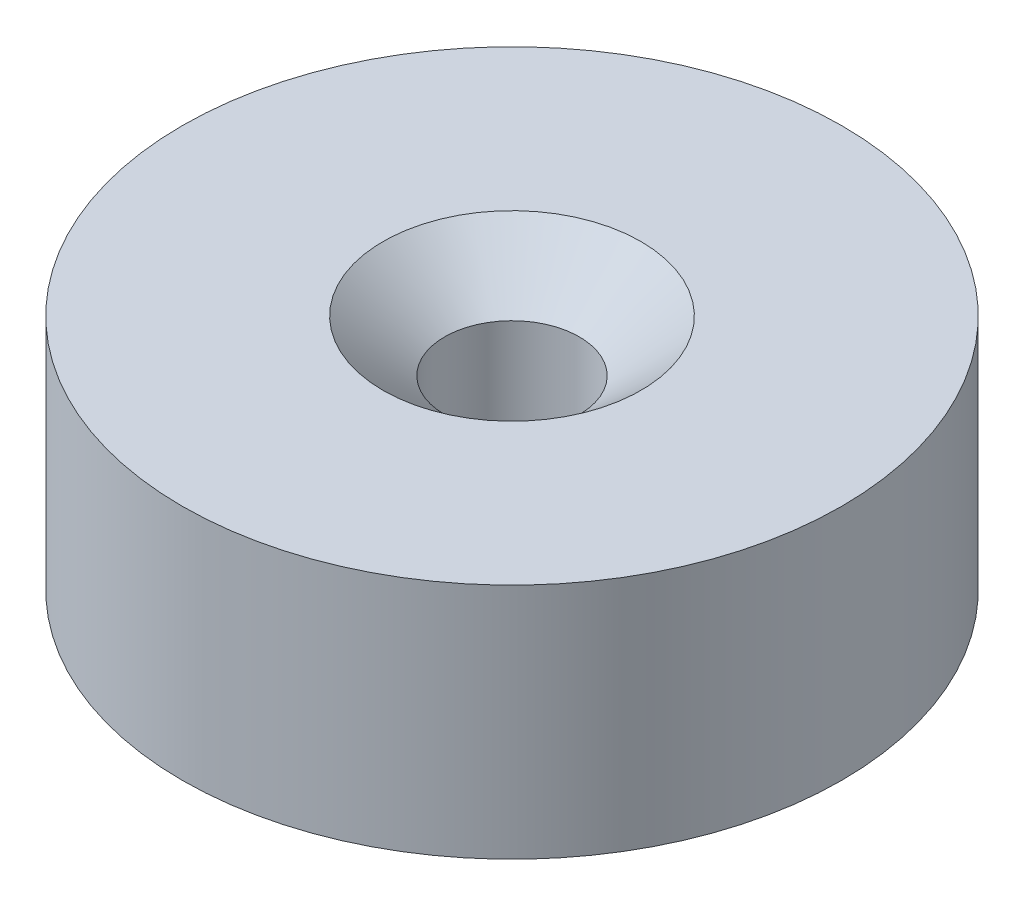
ISO-10303-21;
HEADER;
FILE_DESCRIPTION(('STEP AP214'),'2;1');
FILE_NAME('part.step','',(''),(''),'','','');
FILE_SCHEMA(('AUTOMOTIVE_DESIGN { 1 0 10303 214 1 1 1 1 }'));
ENDSEC;
DATA;
#1=APPLICATION_CONTEXT('core data for automotive mechanical design processes');
#2=APPLICATION_PROTOCOL_DEFINITION('international standard','automotive_design',2000,#1);
#3=PRODUCT_CONTEXT('',#1,'mechanical');
#4=PRODUCT('Part','Part','',(#3));
#5=PRODUCT_RELATED_PRODUCT_CATEGORY('part','',(#4));
#6=PRODUCT_DEFINITION_FORMATION('','',#4);
#7=PRODUCT_DEFINITION_CONTEXT('part definition',#1,'design');
#8=PRODUCT_DEFINITION('design','',#6,#7);
#9=PRODUCT_DEFINITION_SHAPE('','',#8);
#10=(LENGTH_UNIT() NAMED_UNIT(*) SI_UNIT(.MILLI.,.METRE.));
#11=(NAMED_UNIT(*) PLANE_ANGLE_UNIT() SI_UNIT($,.RADIAN.));
#12=(NAMED_UNIT(*) SI_UNIT($,.STERADIAN.) SOLID_ANGLE_UNIT());
#13=UNCERTAINTY_MEASURE_WITH_UNIT(LENGTH_MEASURE(1.E-05),#10,'distance_accuracy_value','');
#14=(GEOMETRIC_REPRESENTATION_CONTEXT(3) GLOBAL_UNCERTAINTY_ASSIGNED_CONTEXT((#13)) GLOBAL_UNIT_ASSIGNED_CONTEXT((#10,
#11,#12)) REPRESENTATION_CONTEXT('',''));
#15=CARTESIAN_POINT('',(0.,0.,0.));
#16=DIRECTION('',(0.,0.,1.));
#17=DIRECTION('',(1.,0.,0.));
#18=AXIS2_PLACEMENT_3D('',#15,#16,#17);
#19=CARTESIAN_POINT('',(0.,9.,0.));
#20=DIRECTION('',(0.,1.,0.));
#21=DIRECTION('',(0.,0.,1.));
#22=AXIS2_PLACEMENT_3D('',#19,#20,#21);
#23=PLANE('',#22);
#24=CARTESIAN_POINT('',(0.,9.,0.));
#25=DIRECTION('',(0.,1.,0.));
#26=DIRECTION('',(0.,0.,1.));
#27=AXIS2_PLACEMENT_3D('',#24,#25,#26);
#28=CIRCLE('',#27,4.8895);
#29=CARTESIAN_POINT('',(0.,9.,4.8895));
#30=VERTEX_POINT('',#29);
#31=EDGE_CURVE('E59',#30,#30,#28,.T.);
#32=ORIENTED_EDGE('',*,*,#31,.F.);
#33=EDGE_LOOP('',(#32));
#34=FACE_BOUND('',#33,.T.);
#35=CARTESIAN_POINT('',(0.,9.,0.));
#36=DIRECTION('',(0.,1.,0.));
#37=DIRECTION('',(0.,0.,1.));
#38=AXIS2_PLACEMENT_3D('',#35,#36,#37);
#39=CIRCLE('',#38,12.5);
#40=CARTESIAN_POINT('',(0.,9.,12.5));
#41=VERTEX_POINT('',#40);
#42=EDGE_CURVE('E10',#41,#41,#39,.T.);
#43=ORIENTED_EDGE('',*,*,#42,.T.);
#44=EDGE_LOOP('',(#43));
#45=FACE_BOUND('',#44,.T.);
#46=ADVANCED_FACE('F37',(#34,#45),#23,.T.);
#47=CARTESIAN_POINT('',(0.,0.,0.));
#48=DIRECTION('',(0.,1.,0.));
#49=DIRECTION('',(0.,0.,1.));
#50=AXIS2_PLACEMENT_3D('',#47,#48,#49);
#51=PLANE('',#50);
#52=CARTESIAN_POINT('',(0.,0.,0.));
#53=DIRECTION('',(0.,1.,0.));
#54=DIRECTION('',(0.,0.,1.));
#55=AXIS2_PLACEMENT_3D('',#52,#53,#54);
#56=CIRCLE('',#55,2.5527);
#57=CARTESIAN_POINT('',(0.,0.,2.5527));
#58=VERTEX_POINT('',#57);
#59=EDGE_CURVE('E50',#58,#58,#56,.T.);
#60=ORIENTED_EDGE('',*,*,#59,.T.);
#61=EDGE_LOOP('',(#60));
#62=FACE_BOUND('',#61,.T.);
#63=CARTESIAN_POINT('',(0.,0.,0.));
#64=DIRECTION('',(0.,1.,0.));
#65=DIRECTION('',(0.,0.,1.));
#66=AXIS2_PLACEMENT_3D('',#63,#64,#65);
#67=CIRCLE('',#66,12.5);
#68=CARTESIAN_POINT('',(0.,0.,12.5));
#69=VERTEX_POINT('',#68);
#70=EDGE_CURVE('E41',#69,#69,#67,.T.);
#71=ORIENTED_EDGE('',*,*,#70,.F.);
#72=EDGE_LOOP('',(#71));
#73=FACE_BOUND('',#72,.T.);
#74=ADVANCED_FACE('F67',(#62,#73),#51,.F.);
#75=CARTESIAN_POINT('',(0.,9.,0.));
#76=DIRECTION('',(0.,-1.,0.));
#77=DIRECTION('',(0.,0.,-1.));
#78=AXIS2_PLACEMENT_3D('',#75,#76,#77);
#79=CYLINDRICAL_SURFACE('',#78,12.5);
#80=ORIENTED_EDGE('',*,*,#42,.F.);
#81=EDGE_LOOP('',(#80));
#82=FACE_BOUND('',#81,.T.);
#83=ORIENTED_EDGE('',*,*,#70,.T.);
#84=EDGE_LOOP('',(#83));
#85=FACE_BOUND('',#84,.T.);
#86=ADVANCED_FACE('F39',(#82,#85),#79,.T.);
#87=CARTESIAN_POINT('',(0.,9.,0.));
#88=DIRECTION('',(0.,1.,0.));
#89=DIRECTION('',(0.,0.,1.));
#90=AXIS2_PLACEMENT_3D('',#87,#88,#89);
#91=CYLINDRICAL_SURFACE('',#90,2.5527);
#92=ORIENTED_EDGE('',*,*,#59,.F.);
#93=EDGE_LOOP('',(#92));
#94=FACE_BOUND('',#93,.T.);
#95=CARTESIAN_POINT('',(0.,7.03919198186493,0.));
#96=DIRECTION('',(0.,1.,0.));
#97=DIRECTION('',(0.,0.,1.));
#98=AXIS2_PLACEMENT_3D('',#95,#96,#97);
#99=CIRCLE('',#98,2.5527);
#100=CARTESIAN_POINT('',(0.,7.03919198186493,2.5527));
#101=VERTEX_POINT('',#100);
#102=EDGE_CURVE('E55',#101,#101,#99,.T.);
#103=ORIENTED_EDGE('',*,*,#102,.T.);
#104=EDGE_LOOP('',(#103));
#105=FACE_BOUND('',#104,.T.);
#106=ADVANCED_FACE('F74',(#94,#105),#91,.F.);
#107=CARTESIAN_POINT('',(0.,9.,0.));
#108=DIRECTION('',(0.,1.,0.));
#109=DIRECTION('',(0.,0.,1.));
#110=AXIS2_PLACEMENT_3D('',#107,#108,#109);
#111=CONICAL_SURFACE('',#110,4.8895,0.872664625997165);
#112=ORIENTED_EDGE('',*,*,#102,.F.);
#113=EDGE_LOOP('',(#112));
#114=FACE_BOUND('',#113,.T.);
#115=ORIENTED_EDGE('',*,*,#31,.T.);
#116=EDGE_LOOP('',(#115));
#117=FACE_BOUND('',#116,.T.);
#118=ADVANCED_FACE('F64',(#114,#117),#111,.F.);
#119=CLOSED_SHELL('',(#46,#74,#86,#106,#118));
#120=MANIFOLD_SOLID_BREP('B2',#119);
#121=ADVANCED_BREP_SHAPE_REPRESENTATION('',(#18,#120),#14);
#122=SHAPE_DEFINITION_REPRESENTATION(#9,#121);
ENDSEC;
END-ISO-10303-21;
